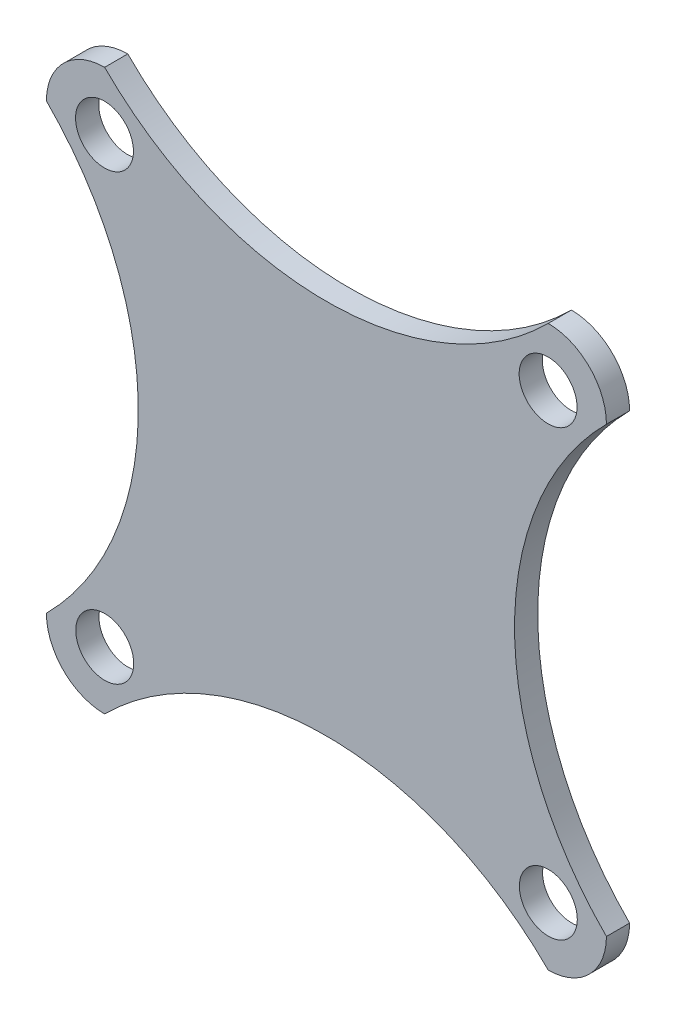
ISO-10303-21;
HEADER;
FILE_DESCRIPTION(('STEP AP214'),'2;1');
FILE_NAME('part.step','',(''),(''),'','','');
FILE_SCHEMA(('AUTOMOTIVE_DESIGN { 1 0 10303 214 1 1 1 1 }'));
ENDSEC;
DATA;
#1=APPLICATION_CONTEXT('core data for automotive mechanical design processes');
#2=APPLICATION_PROTOCOL_DEFINITION('international standard','automotive_design',2000,#1);
#3=PRODUCT_CONTEXT('',#1,'mechanical');
#4=PRODUCT('Part','Part','',(#3));
#5=PRODUCT_RELATED_PRODUCT_CATEGORY('part','',(#4));
#6=PRODUCT_DEFINITION_FORMATION('','',#4);
#7=PRODUCT_DEFINITION_CONTEXT('part definition',#1,'design');
#8=PRODUCT_DEFINITION('design','',#6,#7);
#9=PRODUCT_DEFINITION_SHAPE('','',#8);
#10=(LENGTH_UNIT() NAMED_UNIT(*) SI_UNIT(.MILLI.,.METRE.));
#11=(NAMED_UNIT(*) PLANE_ANGLE_UNIT() SI_UNIT($,.RADIAN.));
#12=(NAMED_UNIT(*) SI_UNIT($,.STERADIAN.) SOLID_ANGLE_UNIT());
#13=UNCERTAINTY_MEASURE_WITH_UNIT(LENGTH_MEASURE(1.E-05),#10,'distance_accuracy_value','');
#14=(GEOMETRIC_REPRESENTATION_CONTEXT(3) GLOBAL_UNCERTAINTY_ASSIGNED_CONTEXT((#13)) GLOBAL_UNIT_ASSIGNED_CONTEXT((#10,
#11,#12)) REPRESENTATION_CONTEXT('',''));
#15=CARTESIAN_POINT('',(0.,0.,0.));
#16=DIRECTION('',(0.,0.,1.));
#17=DIRECTION('',(1.,0.,0.));
#18=AXIS2_PLACEMENT_3D('',#15,#16,#17);
#19=CARTESIAN_POINT('',(-64.0200001547901,-1.00640379452224,1.8));
#20=DIRECTION('',(0.,0.,-1.));
#21=DIRECTION('',(-1.,0.,0.));
#22=AXIS2_PLACEMENT_3D('',#19,#20,#21);
#23=CYLINDRICAL_SURFACE('',#22,24.37417533086);
#24=CARTESIAN_POINT('',(-64.0200001547901,-1.00640379452224,0.));
#25=DIRECTION('',(0.,0.,1.));
#26=DIRECTION('',(1.,0.,0.));
#27=AXIS2_PLACEMENT_3D('',#24,#25,#26);
#28=CIRCLE('',#27,24.37417533086);
#29=CARTESIAN_POINT('',(-81.2551448170997,-18.2415484567747,0.));
#30=VERTEX_POINT('',#29);
#31=CARTESIAN_POINT('',(-46.7848554924997,-18.2415484567938,0.));
#32=VERTEX_POINT('',#31);
#33=EDGE_CURVE('E139',#30,#32,#28,.T.);
#34=ORIENTED_EDGE('',*,*,#33,.F.);
#35=DIRECTION('',(0.,0.,-1.));
#36=VECTOR('',#35,1.);
#37=CARTESIAN_POINT('',(-81.2551448170997,-18.2415484567747,1.8));
#38=LINE('',#37,#36);
#39=CARTESIAN_POINT('',(-81.2551448170997,-18.2415484567747,1.8));
#40=VERTEX_POINT('',#39);
#41=EDGE_CURVE('E11',#40,#30,#38,.T.);
#42=ORIENTED_EDGE('',*,*,#41,.F.);
#43=CARTESIAN_POINT('',(-64.0200001547901,-1.00640379452224,1.8));
#44=DIRECTION('',(0.,0.,1.));
#45=DIRECTION('',(1.,0.,0.));
#46=AXIS2_PLACEMENT_3D('',#43,#44,#45);
#47=CIRCLE('',#46,24.37417533086);
#48=CARTESIAN_POINT('',(-46.7848554924997,-18.2415484567938,1.8));
#49=VERTEX_POINT('',#48);
#50=EDGE_CURVE('E188',#40,#49,#47,.T.);
#51=ORIENTED_EDGE('',*,*,#50,.T.);
#52=DIRECTION('',(0.,0.,-1.));
#53=VECTOR('',#52,1.);
#54=CARTESIAN_POINT('',(-46.7848554924997,-18.2415484567938,1.8));
#55=LINE('',#54,#53);
#56=EDGE_CURVE('E84',#49,#32,#55,.T.);
#57=ORIENTED_EDGE('',*,*,#56,.T.);
#58=EDGE_LOOP('',(#34,#42,#51,#57));
#59=FACE_BOUND('',#58,.T.);
#60=ADVANCED_FACE('F33',(#59),#23,.F.);
#61=CARTESIAN_POINT('',(-81.2551448170997,-22.7648553377053,1.8));
#62=DIRECTION('',(0.,0.,-1.));
#63=DIRECTION('',(-1.,0.,0.));
#64=AXIS2_PLACEMENT_3D('',#61,#62,#63);
#65=CYLINDRICAL_SURFACE('',#64,4.52330688093057);
#66=CARTESIAN_POINT('',(-81.2551448170997,-22.7648553377053,0.));
#67=DIRECTION('',(0.,0.,1.));
#68=DIRECTION('',(1.,0.,0.));
#69=AXIS2_PLACEMENT_3D('',#66,#67,#68);
#70=CIRCLE('',#69,4.52330688093057);
#71=CARTESIAN_POINT('',(-85.7784516980302,-22.7648553377,0.));
#72=VERTEX_POINT('',#71);
#73=EDGE_CURVE('E142',#30,#72,#70,.T.);
#74=ORIENTED_EDGE('',*,*,#73,.T.);
#75=DIRECTION('',(0.,0.,-1.));
#76=VECTOR('',#75,1.);
#77=CARTESIAN_POINT('',(-85.7784516980302,-22.7648553377,1.8));
#78=LINE('',#77,#76);
#79=CARTESIAN_POINT('',(-85.7784516980302,-22.7648553377,1.8));
#80=VERTEX_POINT('',#79);
#81=EDGE_CURVE('E42',#80,#72,#78,.T.);
#82=ORIENTED_EDGE('',*,*,#81,.F.);
#83=CARTESIAN_POINT('',(-81.2551448170997,-22.7648553377053,1.8));
#84=DIRECTION('',(0.,0.,1.));
#85=DIRECTION('',(1.,0.,0.));
#86=AXIS2_PLACEMENT_3D('',#83,#84,#85);
#87=CIRCLE('',#86,4.52330688093057);
#88=EDGE_CURVE('E186',#40,#80,#87,.T.);
#89=ORIENTED_EDGE('',*,*,#88,.F.);
#90=ORIENTED_EDGE('',*,*,#41,.T.);
#91=EDGE_LOOP('',(#74,#82,#89,#90));
#92=FACE_BOUND('',#91,.T.);
#93=ADVANCED_FACE('F175',(#92),#65,.T.);
#94=CARTESIAN_POINT('',(-103.013596360234,-40.0000000000578,1.8));
#95=DIRECTION('',(0.,0.,-1.));
#96=DIRECTION('',(-1.,0.,0.));
#97=AXIS2_PLACEMENT_3D('',#94,#95,#96);
#98=CYLINDRICAL_SURFACE('',#97,24.37417533086);
#99=CARTESIAN_POINT('',(-103.013596360234,-40.0000000000578,0.));
#100=DIRECTION('',(0.,0.,1.));
#101=DIRECTION('',(1.,0.,0.));
#102=AXIS2_PLACEMENT_3D('',#99,#100,#101);
#103=CIRCLE('',#102,24.37417533086);
#104=CARTESIAN_POINT('',(-85.7784516979146,-57.2351446623,0.));
#105=VERTEX_POINT('',#104);
#106=EDGE_CURVE('E145',#105,#72,#103,.T.);
#107=ORIENTED_EDGE('',*,*,#106,.F.);
#108=DIRECTION('',(0.,0.,-1.));
#109=VECTOR('',#108,1.);
#110=CARTESIAN_POINT('',(-85.7784516979146,-57.2351446623,1.8));
#111=LINE('',#110,#109);
#112=CARTESIAN_POINT('',(-85.7784516979146,-57.2351446623,1.8));
#113=VERTEX_POINT('',#112);
#114=EDGE_CURVE('E165',#113,#105,#111,.T.);
#115=ORIENTED_EDGE('',*,*,#114,.F.);
#116=CARTESIAN_POINT('',(-103.013596360234,-40.0000000000578,1.8));
#117=DIRECTION('',(0.,0.,1.));
#118=DIRECTION('',(1.,0.,0.));
#119=AXIS2_PLACEMENT_3D('',#116,#117,#118);
#120=CIRCLE('',#119,24.37417533086);
#121=EDGE_CURVE('E172',#113,#80,#120,.T.);
#122=ORIENTED_EDGE('',*,*,#121,.T.);
#123=ORIENTED_EDGE('',*,*,#81,.T.);
#124=EDGE_LOOP('',(#107,#115,#122,#123));
#125=FACE_BOUND('',#124,.T.);
#126=ADVANCED_FACE('F170',(#125),#98,.F.);
#127=CARTESIAN_POINT('',(-81.2551448170997,-57.2351446623,1.8));
#128=DIRECTION('',(0.,0.,-1.));
#129=DIRECTION('',(-1.,0.,0.));
#130=AXIS2_PLACEMENT_3D('',#127,#128,#129);
#131=CYLINDRICAL_SURFACE('',#130,4.52330688081491);
#132=CARTESIAN_POINT('',(-81.2551448170997,-57.2351446623,0.));
#133=DIRECTION('',(0.,0.,1.));
#134=DIRECTION('',(1.,0.,0.));
#135=AXIS2_PLACEMENT_3D('',#132,#133,#134);
#136=CIRCLE('',#135,4.52330688081491);
#137=CARTESIAN_POINT('',(-81.2551448170997,-61.7584515431149,0.));
#138=VERTEX_POINT('',#137);
#139=EDGE_CURVE('E148',#105,#138,#136,.T.);
#140=ORIENTED_EDGE('',*,*,#139,.T.);
#141=DIRECTION('',(0.,0.,-1.));
#142=VECTOR('',#141,1.);
#143=CARTESIAN_POINT('',(-81.2551448170997,-61.7584515431149,1.8));
#144=LINE('',#143,#142);
#145=CARTESIAN_POINT('',(-81.2551448170997,-61.7584515431149,1.8));
#146=VERTEX_POINT('',#145);
#147=EDGE_CURVE('E163',#146,#138,#144,.T.);
#148=ORIENTED_EDGE('',*,*,#147,.F.);
#149=CARTESIAN_POINT('',(-81.2551448170997,-57.2351446623,1.8));
#150=DIRECTION('',(0.,0.,1.));
#151=DIRECTION('',(1.,0.,0.));
#152=AXIS2_PLACEMENT_3D('',#149,#150,#151);
#153=CIRCLE('',#152,4.52330688081491);
#154=EDGE_CURVE('E184',#113,#146,#153,.T.);
#155=ORIENTED_EDGE('',*,*,#154,.F.);
#156=ORIENTED_EDGE('',*,*,#114,.T.);
#157=EDGE_LOOP('',(#140,#148,#155,#156));
#158=FACE_BOUND('',#157,.T.);
#159=ADVANCED_FACE('F182',(#158),#131,.T.);
#160=CARTESIAN_POINT('',(-64.0200001548605,-78.9935962054391,1.8));
#161=DIRECTION('',(0.,0.,-1.));
#162=DIRECTION('',(-1.,0.,0.));
#163=AXIS2_PLACEMENT_3D('',#160,#161,#162);
#164=CYLINDRICAL_SURFACE('',#163,24.374175330861);
#165=CARTESIAN_POINT('',(-64.0200001548605,-78.9935962054391,0.));
#166=DIRECTION('',(0.,0.,1.));
#167=DIRECTION('',(1.,0.,0.));
#168=AXIS2_PLACEMENT_3D('',#165,#166,#167);
#169=CIRCLE('',#168,24.374175330861);
#170=CARTESIAN_POINT('',(-46.784855492618,-61.7584515431183,0.));
#171=VERTEX_POINT('',#170);
#172=EDGE_CURVE('E151',#171,#138,#169,.T.);
#173=ORIENTED_EDGE('',*,*,#172,.F.);
#174=DIRECTION('',(0.,0.,-1.));
#175=VECTOR('',#174,1.);
#176=CARTESIAN_POINT('',(-46.784855492618,-61.7584515431183,1.8));
#177=LINE('',#176,#175);
#178=CARTESIAN_POINT('',(-46.784855492618,-61.7584515431183,1.8));
#179=VERTEX_POINT('',#178);
#180=EDGE_CURVE('E120',#179,#171,#177,.T.);
#181=ORIENTED_EDGE('',*,*,#180,.F.);
#182=CARTESIAN_POINT('',(-64.0200001548605,-78.9935962054391,1.8));
#183=DIRECTION('',(0.,0.,1.));
#184=DIRECTION('',(1.,0.,0.));
#185=AXIS2_PLACEMENT_3D('',#182,#183,#184);
#186=CIRCLE('',#185,24.374175330861);
#187=EDGE_CURVE('E109',#179,#146,#186,.T.);
#188=ORIENTED_EDGE('',*,*,#187,.T.);
#189=ORIENTED_EDGE('',*,*,#147,.T.);
#190=EDGE_LOOP('',(#173,#181,#188,#189));
#191=FACE_BOUND('',#190,.T.);
#192=ADVANCED_FACE('F192',(#191),#164,.F.);
#193=CARTESIAN_POINT('',(-46.7848554925049,-57.2351446623,1.8));
#194=DIRECTION('',(0.,0.,-1.));
#195=DIRECTION('',(-1.,0.,0.));
#196=AXIS2_PLACEMENT_3D('',#193,#194,#195);
#197=CYLINDRICAL_SURFACE('',#196,4.52330688081832);
#198=CARTESIAN_POINT('',(-46.7848554925049,-57.2351446623,0.));
#199=DIRECTION('',(0.,0.,1.));
#200=DIRECTION('',(1.,0.,0.));
#201=AXIS2_PLACEMENT_3D('',#198,#199,#200);
#202=CIRCLE('',#201,4.52330688081832);
#203=CARTESIAN_POINT('',(-42.2615486116866,-57.2351446623,0.));
#204=VERTEX_POINT('',#203);
#205=EDGE_CURVE('E116',#171,#204,#202,.T.);
#206=ORIENTED_EDGE('',*,*,#205,.T.);
#207=DIRECTION('',(0.,0.,-1.));
#208=VECTOR('',#207,1.);
#209=CARTESIAN_POINT('',(-42.2615486116866,-57.2351446623,1.8));
#210=LINE('',#209,#208);
#211=CARTESIAN_POINT('',(-42.2615486116866,-57.2351446623,1.8));
#212=VERTEX_POINT('',#211);
#213=EDGE_CURVE('E113',#212,#204,#210,.T.);
#214=ORIENTED_EDGE('',*,*,#213,.F.);
#215=CARTESIAN_POINT('',(-46.7848554925049,-57.2351446623,1.8));
#216=DIRECTION('',(0.,0.,1.));
#217=DIRECTION('',(1.,0.,0.));
#218=AXIS2_PLACEMENT_3D('',#215,#216,#217);
#219=CIRCLE('',#218,4.52330688081832);
#220=EDGE_CURVE('E103',#179,#212,#219,.T.);
#221=ORIENTED_EDGE('',*,*,#220,.F.);
#222=ORIENTED_EDGE('',*,*,#180,.T.);
#223=EDGE_LOOP('',(#206,#214,#221,#222));
#224=FACE_BOUND('',#223,.T.);
#225=ADVANCED_FACE('F114',(#224),#197,.T.);
#226=CARTESIAN_POINT('',(-25.0264039493589,-40.0000000000523,1.8));
#227=DIRECTION('',(0.,0.,-1.));
#228=DIRECTION('',(-1.,0.,0.));
#229=AXIS2_PLACEMENT_3D('',#226,#227,#228);
#230=CYLINDRICAL_SURFACE('',#229,24.3741753308601);
#231=CARTESIAN_POINT('',(-25.0264039493589,-40.0000000000523,0.));
#232=DIRECTION('',(0.,0.,1.));
#233=DIRECTION('',(1.,0.,0.));
#234=AXIS2_PLACEMENT_3D('',#231,#232,#233);
#235=CIRCLE('',#234,24.3741753308601);
#236=CARTESIAN_POINT('',(-42.2615486115931,-22.7648553377056,0.));
#237=VERTEX_POINT('',#236);
#238=EDGE_CURVE('E155',#237,#204,#235,.T.);
#239=ORIENTED_EDGE('',*,*,#238,.F.);
#240=DIRECTION('',(0.,0.,-1.));
#241=VECTOR('',#240,1.);
#242=CARTESIAN_POINT('',(-42.2615486115931,-22.7648553377056,1.8));
#243=LINE('',#242,#241);
#244=CARTESIAN_POINT('',(-42.2615486115931,-22.7648553377056,1.8));
#245=VERTEX_POINT('',#244);
#246=EDGE_CURVE('E77',#245,#237,#243,.T.);
#247=ORIENTED_EDGE('',*,*,#246,.F.);
#248=CARTESIAN_POINT('',(-25.0264039493589,-40.0000000000523,1.8));
#249=DIRECTION('',(0.,0.,1.));
#250=DIRECTION('',(1.,0.,0.));
#251=AXIS2_PLACEMENT_3D('',#248,#249,#250);
#252=CIRCLE('',#251,24.3741753308601);
#253=EDGE_CURVE('E107',#245,#212,#252,.T.);
#254=ORIENTED_EDGE('',*,*,#253,.T.);
#255=ORIENTED_EDGE('',*,*,#213,.T.);
#256=EDGE_LOOP('',(#239,#247,#254,#255));
#257=FACE_BOUND('',#256,.T.);
#258=ADVANCED_FACE('F122',(#257),#230,.F.);
#259=CARTESIAN_POINT('',(-46.7939289928,-22.7557818374,1.8));
#260=DIRECTION('',(0.,0.,-1.));
#261=DIRECTION('',(-1.,0.,0.));
#262=AXIS2_PLACEMENT_3D('',#259,#260,#261);
#263=CYLINDRICAL_SURFACE('',#262,2.25);
#264=CARTESIAN_POINT('',(-46.7939289928,-22.7557818374,1.8));
#265=DIRECTION('',(0.,0.,1.));
#266=DIRECTION('',(1.,0.,0.));
#267=AXIS2_PLACEMENT_3D('',#264,#265,#266);
#268=CIRCLE('',#267,2.25);
#269=CARTESIAN_POINT('',(-44.5439289928,-22.7557818374,1.8));
#270=VERTEX_POINT('',#269);
#271=EDGE_CURVE('E194',#270,#270,#268,.T.);
#272=ORIENTED_EDGE('',*,*,#271,.T.);
#273=EDGE_LOOP('',(#272));
#274=FACE_BOUND('',#273,.T.);
#275=CARTESIAN_POINT('',(-46.7939289928,-22.7557818374,0.));
#276=DIRECTION('',(0.,0.,1.));
#277=DIRECTION('',(1.,0.,0.));
#278=AXIS2_PLACEMENT_3D('',#275,#276,#277);
#279=CIRCLE('',#278,2.25);
#280=CARTESIAN_POINT('',(-44.5439289928,-22.7557818374,0.));
#281=VERTEX_POINT('',#280);
#282=EDGE_CURVE('E136',#281,#281,#279,.T.);
#283=ORIENTED_EDGE('',*,*,#282,.F.);
#284=EDGE_LOOP('',(#283));
#285=FACE_BOUND('',#284,.T.);
#286=ADVANCED_FACE('F218',(#274,#285),#263,.F.);
#287=CARTESIAN_POINT('',(-46.7757819922,-57.2260711619,1.8));
#288=DIRECTION('',(0.,0.,-1.));
#289=DIRECTION('',(-1.,0.,0.));
#290=AXIS2_PLACEMENT_3D('',#287,#288,#289);
#291=CYLINDRICAL_SURFACE('',#290,2.25);
#292=CARTESIAN_POINT('',(-46.7757819922,-57.2260711619,1.8));
#293=DIRECTION('',(0.,0.,1.));
#294=DIRECTION('',(1.,0.,0.));
#295=AXIS2_PLACEMENT_3D('',#292,#293,#294);
#296=CIRCLE('',#295,2.25);
#297=CARTESIAN_POINT('',(-44.5257819922,-57.2260711619,1.8));
#298=VERTEX_POINT('',#297);
#299=EDGE_CURVE('E196',#298,#298,#296,.T.);
#300=ORIENTED_EDGE('',*,*,#299,.T.);
#301=EDGE_LOOP('',(#300));
#302=FACE_BOUND('',#301,.T.);
#303=CARTESIAN_POINT('',(-46.7757819922,-57.2260711619,0.));
#304=DIRECTION('',(0.,0.,1.));
#305=DIRECTION('',(1.,0.,0.));
#306=AXIS2_PLACEMENT_3D('',#303,#304,#305);
#307=CIRCLE('',#306,2.25);
#308=CARTESIAN_POINT('',(-44.5257819922,-57.2260711619,0.));
#309=VERTEX_POINT('',#308);
#310=EDGE_CURVE('E133',#309,#309,#307,.T.);
#311=ORIENTED_EDGE('',*,*,#310,.F.);
#312=EDGE_LOOP('',(#311));
#313=FACE_BOUND('',#312,.T.);
#314=ADVANCED_FACE('F221',(#302,#313),#291,.F.);
#315=CARTESIAN_POINT('',(-81.2460713167,-57.2442181626,1.8));
#316=DIRECTION('',(0.,0.,-1.));
#317=DIRECTION('',(-1.,0.,0.));
#318=AXIS2_PLACEMENT_3D('',#315,#316,#317);
#319=CYLINDRICAL_SURFACE('',#318,2.24999999999999);
#320=CARTESIAN_POINT('',(-81.2460713167,-57.2442181626,1.8));
#321=DIRECTION('',(0.,0.,1.));
#322=DIRECTION('',(1.,0.,0.));
#323=AXIS2_PLACEMENT_3D('',#320,#321,#322);
#324=CIRCLE('',#323,2.24999999999999);
#325=CARTESIAN_POINT('',(-78.9960713167,-57.2442181626,1.8));
#326=VERTEX_POINT('',#325);
#327=EDGE_CURVE('E201',#326,#326,#324,.T.);
#328=ORIENTED_EDGE('',*,*,#327,.T.);
#329=EDGE_LOOP('',(#328));
#330=FACE_BOUND('',#329,.T.);
#331=CARTESIAN_POINT('',(-81.2460713167,-57.2442181626,0.));
#332=DIRECTION('',(0.,0.,1.));
#333=DIRECTION('',(1.,0.,0.));
#334=AXIS2_PLACEMENT_3D('',#331,#332,#333);
#335=CIRCLE('',#334,2.24999999999999);
#336=CARTESIAN_POINT('',(-78.9960713167,-57.2442181626,0.));
#337=VERTEX_POINT('',#336);
#338=EDGE_CURVE('E130',#337,#337,#335,.T.);
#339=ORIENTED_EDGE('',*,*,#338,.F.);
#340=EDGE_LOOP('',(#339));
#341=FACE_BOUND('',#340,.T.);
#342=ADVANCED_FACE('F241',(#330,#341),#319,.F.);
#343=CARTESIAN_POINT('',(-81.2642183174,-22.773928838,1.8));
#344=DIRECTION('',(0.,0.,-1.));
#345=DIRECTION('',(-1.,0.,0.));
#346=AXIS2_PLACEMENT_3D('',#343,#344,#345);
#347=CYLINDRICAL_SURFACE('',#346,2.24999999999999);
#348=CARTESIAN_POINT('',(-81.2642183174,-22.773928838,1.8));
#349=DIRECTION('',(0.,0.,1.));
#350=DIRECTION('',(1.,0.,0.));
#351=AXIS2_PLACEMENT_3D('',#348,#349,#350);
#352=CIRCLE('',#351,2.24999999999999);
#353=CARTESIAN_POINT('',(-79.0142183174,-22.773928838,1.8));
#354=VERTEX_POINT('',#353);
#355=EDGE_CURVE('E159',#354,#354,#352,.T.);
#356=ORIENTED_EDGE('',*,*,#355,.T.);
#357=EDGE_LOOP('',(#356));
#358=FACE_BOUND('',#357,.T.);
#359=CARTESIAN_POINT('',(-81.2642183174,-22.773928838,0.));
#360=DIRECTION('',(0.,0.,1.));
#361=DIRECTION('',(1.,0.,0.));
#362=AXIS2_PLACEMENT_3D('',#359,#360,#361);
#363=CIRCLE('',#362,2.24999999999999);
#364=CARTESIAN_POINT('',(-79.0142183174,-22.773928838,0.));
#365=VERTEX_POINT('',#364);
#366=EDGE_CURVE('E127',#365,#365,#363,.T.);
#367=ORIENTED_EDGE('',*,*,#366,.F.);
#368=EDGE_LOOP('',(#367));
#369=FACE_BOUND('',#368,.T.);
#370=ADVANCED_FACE('F35',(#358,#369),#347,.F.);
#371=CARTESIAN_POINT('',(-46.7848554925049,-22.7648553377056,1.8));
#372=DIRECTION('',(0.,0.,-1.));
#373=DIRECTION('',(-1.,0.,0.));
#374=AXIS2_PLACEMENT_3D('',#371,#372,#373);
#375=CYLINDRICAL_SURFACE('',#374,4.52330688091179);
#376=CARTESIAN_POINT('',(-46.7848554925049,-22.7648553377056,0.));
#377=DIRECTION('',(0.,0.,1.));
#378=DIRECTION('',(1.,0.,0.));
#379=AXIS2_PLACEMENT_3D('',#376,#377,#378);
#380=CIRCLE('',#379,4.52330688091179);
#381=EDGE_CURVE('E157',#237,#32,#380,.T.);
#382=ORIENTED_EDGE('',*,*,#381,.T.);
#383=ORIENTED_EDGE('',*,*,#56,.F.);
#384=CARTESIAN_POINT('',(-46.7848554925049,-22.7648553377056,1.8));
#385=DIRECTION('',(0.,0.,1.));
#386=DIRECTION('',(1.,0.,0.));
#387=AXIS2_PLACEMENT_3D('',#384,#385,#386);
#388=CIRCLE('',#387,4.52330688091179);
#389=EDGE_CURVE('E50',#245,#49,#388,.T.);
#390=ORIENTED_EDGE('',*,*,#389,.F.);
#391=ORIENTED_EDGE('',*,*,#246,.T.);
#392=EDGE_LOOP('',(#382,#383,#390,#391));
#393=FACE_BOUND('',#392,.T.);
#394=ADVANCED_FACE('F193',(#393),#375,.T.);
#395=CARTESIAN_POINT('',(0.,0.,1.8));
#396=DIRECTION('',(0.,0.,1.));
#397=DIRECTION('',(1.,0.,0.));
#398=AXIS2_PLACEMENT_3D('',#395,#396,#397);
#399=PLANE('',#398);
#400=ORIENTED_EDGE('',*,*,#355,.F.);
#401=EDGE_LOOP('',(#400));
#402=FACE_BOUND('',#401,.T.);
#403=ORIENTED_EDGE('',*,*,#327,.F.);
#404=EDGE_LOOP('',(#403));
#405=FACE_BOUND('',#404,.T.);
#406=ORIENTED_EDGE('',*,*,#299,.F.);
#407=EDGE_LOOP('',(#406));
#408=FACE_BOUND('',#407,.T.);
#409=ORIENTED_EDGE('',*,*,#271,.F.);
#410=EDGE_LOOP('',(#409));
#411=FACE_BOUND('',#410,.T.);
#412=ORIENTED_EDGE('',*,*,#50,.F.);
#413=ORIENTED_EDGE('',*,*,#88,.T.);
#414=ORIENTED_EDGE('',*,*,#121,.F.);
#415=ORIENTED_EDGE('',*,*,#154,.T.);
#416=ORIENTED_EDGE('',*,*,#187,.F.);
#417=ORIENTED_EDGE('',*,*,#220,.T.);
#418=ORIENTED_EDGE('',*,*,#253,.F.);
#419=ORIENTED_EDGE('',*,*,#389,.T.);
#420=EDGE_LOOP('',(#412,#413,#414,#415,#416,#417,#418,#419));
#421=FACE_BOUND('',#420,.T.);
#422=ADVANCED_FACE('F105',(#402,#405,#408,#411,#421),#399,.T.);
#423=CARTESIAN_POINT('',(0.,0.,0.));
#424=DIRECTION('',(0.,0.,1.));
#425=DIRECTION('',(1.,0.,0.));
#426=AXIS2_PLACEMENT_3D('',#423,#424,#425);
#427=PLANE('',#426);
#428=ORIENTED_EDGE('',*,*,#366,.T.);
#429=EDGE_LOOP('',(#428));
#430=FACE_BOUND('',#429,.T.);
#431=ORIENTED_EDGE('',*,*,#338,.T.);
#432=EDGE_LOOP('',(#431));
#433=FACE_BOUND('',#432,.T.);
#434=ORIENTED_EDGE('',*,*,#310,.T.);
#435=EDGE_LOOP('',(#434));
#436=FACE_BOUND('',#435,.T.);
#437=ORIENTED_EDGE('',*,*,#282,.T.);
#438=EDGE_LOOP('',(#437));
#439=FACE_BOUND('',#438,.T.);
#440=ORIENTED_EDGE('',*,*,#33,.T.);
#441=ORIENTED_EDGE('',*,*,#381,.F.);
#442=ORIENTED_EDGE('',*,*,#238,.T.);
#443=ORIENTED_EDGE('',*,*,#205,.F.);
#444=ORIENTED_EDGE('',*,*,#172,.T.);
#445=ORIENTED_EDGE('',*,*,#139,.F.);
#446=ORIENTED_EDGE('',*,*,#106,.T.);
#447=ORIENTED_EDGE('',*,*,#73,.F.);
#448=EDGE_LOOP('',(#440,#441,#442,#443,#444,#445,#446,#447));
#449=FACE_BOUND('',#448,.T.);
#450=ADVANCED_FACE('F178',(#430,#433,#436,#439,#449),#427,.F.);
#451=CLOSED_SHELL('',(#60,#93,#126,#159,#192,#225,#258,#286,#314,#342,#370,#394,#422,#450));
#452=MANIFOLD_SOLID_BREP('B2',#451);
#453=ADVANCED_BREP_SHAPE_REPRESENTATION('',(#18,#452),#14);
#454=SHAPE_DEFINITION_REPRESENTATION(#9,#453);
ENDSEC;
END-ISO-10303-21;
